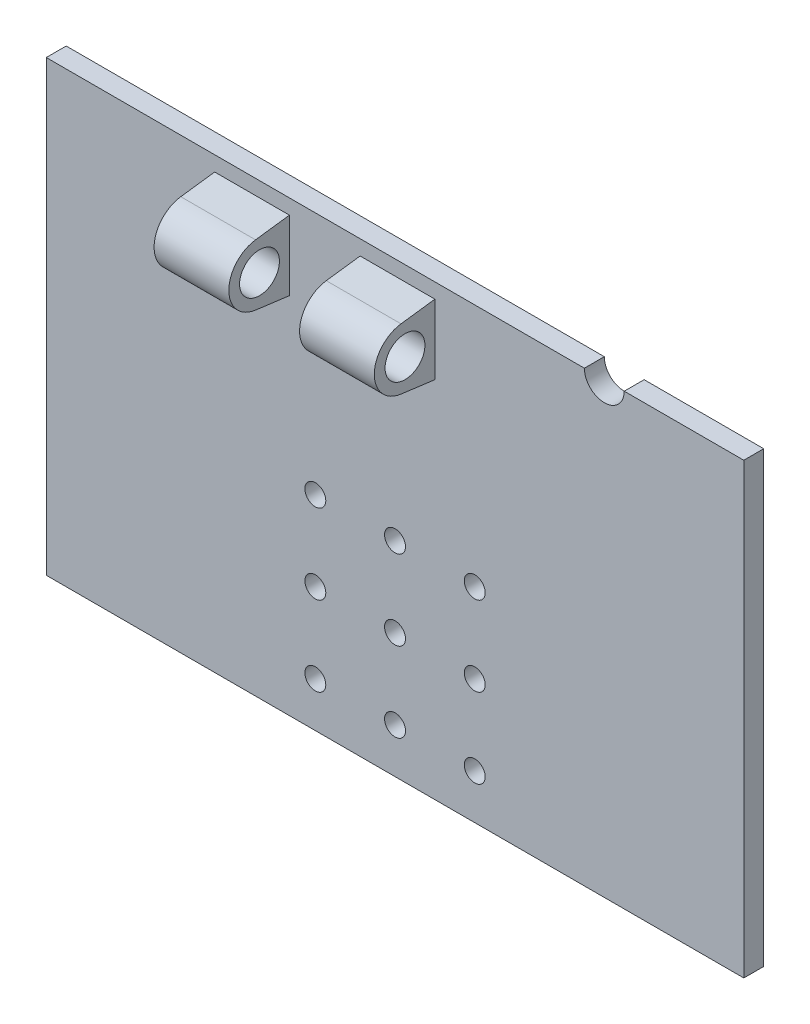
ISO-10303-21;
HEADER;
FILE_DESCRIPTION(('STEP AP214'),'2;1');
FILE_NAME('part.step','',(''),(''),'','','');
FILE_SCHEMA(('AUTOMOTIVE_DESIGN { 1 0 10303 214 1 1 1 1 }'));
ENDSEC;
DATA;
#1=APPLICATION_CONTEXT('core data for automotive mechanical design processes');
#2=APPLICATION_PROTOCOL_DEFINITION('international standard','automotive_design',2000,#1);
#3=PRODUCT_CONTEXT('',#1,'mechanical');
#4=PRODUCT('Part','Part','',(#3));
#5=PRODUCT_RELATED_PRODUCT_CATEGORY('part','',(#4));
#6=PRODUCT_DEFINITION_FORMATION('','',#4);
#7=PRODUCT_DEFINITION_CONTEXT('part definition',#1,'design');
#8=PRODUCT_DEFINITION('design','',#6,#7);
#9=PRODUCT_DEFINITION_SHAPE('','',#8);
#10=(LENGTH_UNIT() NAMED_UNIT(*) SI_UNIT(.MILLI.,.METRE.));
#11=(NAMED_UNIT(*) PLANE_ANGLE_UNIT() SI_UNIT($,.RADIAN.));
#12=(NAMED_UNIT(*) SI_UNIT($,.STERADIAN.) SOLID_ANGLE_UNIT());
#13=UNCERTAINTY_MEASURE_WITH_UNIT(LENGTH_MEASURE(1.E-05),#10,'distance_accuracy_value','');
#14=(GEOMETRIC_REPRESENTATION_CONTEXT(3) GLOBAL_UNCERTAINTY_ASSIGNED_CONTEXT((#13)) GLOBAL_UNIT_ASSIGNED_CONTEXT((#10,
#11,#12)) REPRESENTATION_CONTEXT('',''));
#15=CARTESIAN_POINT('',(0.,0.,0.));
#16=DIRECTION('',(0.,0.,1.));
#17=DIRECTION('',(1.,0.,0.));
#18=AXIS2_PLACEMENT_3D('',#15,#16,#17);
#19=CARTESIAN_POINT('',(0.,45.,2.));
#20=DIRECTION('',(0.,-1.,0.));
#21=DIRECTION('',(0.,0.,-1.));
#22=AXIS2_PLACEMENT_3D('',#19,#20,#21);
#23=PLANE('',#22);
#24=DIRECTION('',(-1.,0.,0.));
#25=VECTOR('',#24,1.);
#26=CARTESIAN_POINT('',(0.,45.,0.));
#27=LINE('',#26,#25);
#28=CARTESIAN_POINT('',(70.,45.,0.));
#29=VERTEX_POINT('',#28);
#30=CARTESIAN_POINT('',(58.,45.,0.));
#31=VERTEX_POINT('',#30);
#32=EDGE_CURVE('E159',#29,#31,#27,.T.);
#33=ORIENTED_EDGE('',*,*,#32,.T.);
#34=DIRECTION('',(0.,0.,1.));
#35=VECTOR('',#34,1.);
#36=CARTESIAN_POINT('',(58.,45.,-8.));
#37=LINE('',#36,#35);
#38=CARTESIAN_POINT('',(58.,45.,2.));
#39=VERTEX_POINT('',#38);
#40=EDGE_CURVE('E60',#31,#39,#37,.T.);
#41=ORIENTED_EDGE('',*,*,#40,.T.);
#42=DIRECTION('',(-1.,0.,0.));
#43=VECTOR('',#42,1.);
#44=CARTESIAN_POINT('',(0.,45.,2.));
#45=LINE('',#44,#43);
#46=CARTESIAN_POINT('',(70.,45.,2.));
#47=VERTEX_POINT('',#46);
#48=EDGE_CURVE('E157',#47,#39,#45,.T.);
#49=ORIENTED_EDGE('',*,*,#48,.F.);
#50=DIRECTION('',(0.,0.,-1.));
#51=VECTOR('',#50,1.);
#52=CARTESIAN_POINT('',(70.,45.,2.));
#53=LINE('',#52,#51);
#54=EDGE_CURVE('E174',#47,#29,#53,.T.);
#55=ORIENTED_EDGE('',*,*,#54,.T.);
#56=EDGE_LOOP('',(#33,#41,#49,#55));
#57=FACE_BOUND('',#56,.T.);
#58=ADVANCED_FACE('F45',(#57),#23,.F.);
#59=CARTESIAN_POINT('',(0.,0.,2.));
#60=DIRECTION('',(0.,0.,-1.));
#61=DIRECTION('',(-1.,0.,0.));
#62=AXIS2_PLACEMENT_3D('',#59,#60,#61);
#63=PLANE('',#62);
#64=DIRECTION('',(0.,-1.,0.));
#65=VECTOR('',#64,1.);
#66=CARTESIAN_POINT('',(24.4,43.5,2.));
#67=LINE('',#66,#65);
#68=CARTESIAN_POINT('',(24.4,43.5,2.));
#69=VERTEX_POINT('',#68);
#70=CARTESIAN_POINT('',(24.4,36.5,2.));
#71=VERTEX_POINT('',#70);
#72=EDGE_CURVE('E299',#69,#71,#67,.T.);
#73=ORIENTED_EDGE('',*,*,#72,.T.);
#74=DIRECTION('',(-1.,0.,0.));
#75=VECTOR('',#74,1.);
#76=CARTESIAN_POINT('',(24.4,36.5,2.));
#77=LINE('',#76,#75);
#78=CARTESIAN_POINT('',(16.9,36.5,2.));
#79=VERTEX_POINT('',#78);
#80=EDGE_CURVE('E284',#71,#79,#77,.T.);
#81=ORIENTED_EDGE('',*,*,#80,.T.);
#82=DIRECTION('',(0.,-1.,0.));
#83=VECTOR('',#82,1.);
#84=CARTESIAN_POINT('',(16.9,43.5,2.));
#85=LINE('',#84,#83);
#86=CARTESIAN_POINT('',(16.9,43.5,2.));
#87=VERTEX_POINT('',#86);
#88=EDGE_CURVE('E309',#87,#79,#85,.T.);
#89=ORIENTED_EDGE('',*,*,#88,.F.);
#90=DIRECTION('',(-1.,0.,0.));
#91=VECTOR('',#90,1.);
#92=CARTESIAN_POINT('',(24.4,43.5,2.));
#93=LINE('',#92,#91);
#94=EDGE_CURVE('E302',#69,#87,#93,.T.);
#95=ORIENTED_EDGE('',*,*,#94,.F.);
#96=EDGE_LOOP('',(#73,#81,#89,#95));
#97=FACE_BOUND('',#96,.T.);
#98=CARTESIAN_POINT('',(43.,4.50000000000011,2.));
#99=DIRECTION('',(0.,0.,1.));
#100=DIRECTION('',(1.,0.,0.));
#101=AXIS2_PLACEMENT_3D('',#98,#99,#100);
#102=CIRCLE('',#101,1.04999999999999);
#103=CARTESIAN_POINT('',(44.05,4.50000000000011,2.));
#104=VERTEX_POINT('',#103);
#105=EDGE_CURVE('E227',#104,#104,#102,.T.);
#106=ORIENTED_EDGE('',*,*,#105,.F.);
#107=EDGE_LOOP('',(#106));
#108=FACE_BOUND('',#107,.T.);
#109=CARTESIAN_POINT('',(27.,4.49999999999995,2.));
#110=DIRECTION('',(0.,0.,1.));
#111=DIRECTION('',(1.,0.,0.));
#112=AXIS2_PLACEMENT_3D('',#109,#110,#111);
#113=CIRCLE('',#112,1.04999999999999);
#114=CARTESIAN_POINT('',(28.05,4.49999999999995,2.));
#115=VERTEX_POINT('',#114);
#116=EDGE_CURVE('E252',#115,#115,#113,.T.);
#117=ORIENTED_EDGE('',*,*,#116,.F.);
#118=EDGE_LOOP('',(#117));
#119=FACE_BOUND('',#118,.T.);
#120=CARTESIAN_POINT('',(35.,12.5,2.));
#121=DIRECTION('',(0.,0.,1.));
#122=DIRECTION('',(1.,0.,0.));
#123=AXIS2_PLACEMENT_3D('',#120,#121,#122);
#124=CIRCLE('',#123,1.04999999999999);
#125=CARTESIAN_POINT('',(36.05,12.5,2.));
#126=VERTEX_POINT('',#125);
#127=EDGE_CURVE('E244',#126,#126,#124,.T.);
#128=ORIENTED_EDGE('',*,*,#127,.F.);
#129=EDGE_LOOP('',(#128));
#130=FACE_BOUND('',#129,.T.);
#131=CARTESIAN_POINT('',(43.,12.5000000000001,2.));
#132=DIRECTION('',(0.,0.,1.));
#133=DIRECTION('',(1.,0.,0.));
#134=AXIS2_PLACEMENT_3D('',#131,#132,#133);
#135=CIRCLE('',#134,1.04999999999999);
#136=CARTESIAN_POINT('',(44.05,12.5000000000001,2.));
#137=VERTEX_POINT('',#136);
#138=EDGE_CURVE('E235',#137,#137,#135,.T.);
#139=ORIENTED_EDGE('',*,*,#138,.F.);
#140=EDGE_LOOP('',(#139));
#141=FACE_BOUND('',#140,.T.);
#142=CARTESIAN_POINT('',(26.9999999999999,20.4999999999999,2.));
#143=DIRECTION('',(0.,0.,1.));
#144=DIRECTION('',(1.,0.,0.));
#145=AXIS2_PLACEMENT_3D('',#142,#143,#144);
#146=CIRCLE('',#145,1.04999999999999);
#147=CARTESIAN_POINT('',(28.0499999999999,20.4999999999999,2.));
#148=VERTEX_POINT('',#147);
#149=EDGE_CURVE('E283',#148,#148,#146,.T.);
#150=ORIENTED_EDGE('',*,*,#149,.F.);
#151=EDGE_LOOP('',(#150));
#152=FACE_BOUND('',#151,.T.);
#153=CARTESIAN_POINT('',(43.,20.5000000000001,2.));
#154=DIRECTION('',(0.,0.,1.));
#155=DIRECTION('',(1.,0.,0.));
#156=AXIS2_PLACEMENT_3D('',#153,#154,#155);
#157=CIRCLE('',#156,1.04999999999999);
#158=CARTESIAN_POINT('',(44.0499999999999,20.5000000000001,2.));
#159=VERTEX_POINT('',#158);
#160=EDGE_CURVE('E268',#159,#159,#157,.T.);
#161=ORIENTED_EDGE('',*,*,#160,.F.);
#162=EDGE_LOOP('',(#161));
#163=FACE_BOUND('',#162,.T.);
#164=CARTESIAN_POINT('',(35.,20.5,2.));
#165=DIRECTION('',(0.,0.,1.));
#166=DIRECTION('',(1.,0.,0.));
#167=AXIS2_PLACEMENT_3D('',#164,#165,#166);
#168=CIRCLE('',#167,1.04999999999999);
#169=CARTESIAN_POINT('',(36.0499999999999,20.5,2.));
#170=VERTEX_POINT('',#169);
#171=EDGE_CURVE('E267',#170,#170,#168,.T.);
#172=ORIENTED_EDGE('',*,*,#171,.F.);
#173=EDGE_LOOP('',(#172));
#174=FACE_BOUND('',#173,.T.);
#175=CARTESIAN_POINT('',(27.,12.4999999999999,2.));
#176=DIRECTION('',(0.,0.,1.));
#177=DIRECTION('',(1.,0.,0.));
#178=AXIS2_PLACEMENT_3D('',#175,#176,#177);
#179=CIRCLE('',#178,1.05);
#180=CARTESIAN_POINT('',(28.05,12.4999999999999,2.));
#181=VERTEX_POINT('',#180);
#182=EDGE_CURVE('E236',#181,#181,#179,.T.);
#183=ORIENTED_EDGE('',*,*,#182,.F.);
#184=EDGE_LOOP('',(#183));
#185=FACE_BOUND('',#184,.T.);
#186=CARTESIAN_POINT('',(35.,4.5,2.));
#187=DIRECTION('',(0.,0.,1.));
#188=DIRECTION('',(1.,0.,0.));
#189=AXIS2_PLACEMENT_3D('',#186,#187,#188);
#190=CIRCLE('',#189,1.04999999999999);
#191=CARTESIAN_POINT('',(36.05,4.5,2.));
#192=VERTEX_POINT('',#191);
#193=EDGE_CURVE('E223',#192,#192,#190,.T.);
#194=ORIENTED_EDGE('',*,*,#193,.F.);
#195=EDGE_LOOP('',(#194));
#196=FACE_BOUND('',#195,.T.);
#197=ORIENTED_EDGE('',*,*,#48,.T.);
#198=CARTESIAN_POINT('',(56.,45.,2.));
#199=DIRECTION('',(0.,0.,1.));
#200=DIRECTION('',(1.,0.,0.));
#201=AXIS2_PLACEMENT_3D('',#198,#199,#200);
#202=CIRCLE('',#201,2.);
#203=CARTESIAN_POINT('',(54.,45.,2.));
#204=VERTEX_POINT('',#203);
#205=EDGE_CURVE('E144',#204,#39,#202,.T.);
#206=ORIENTED_EDGE('',*,*,#205,.F.);
#207=CARTESIAN_POINT('',(0.,45.,2.));
#208=VERTEX_POINT('',#207);
#209=EDGE_CURVE('E169',#204,#208,#45,.T.);
#210=ORIENTED_EDGE('',*,*,#209,.T.);
#211=DIRECTION('',(0.,-1.,0.));
#212=VECTOR('',#211,1.);
#213=CARTESIAN_POINT('',(0.,0.,2.));
#214=LINE('',#213,#212);
#215=CARTESIAN_POINT('',(0.,0.,2.));
#216=VERTEX_POINT('',#215);
#217=EDGE_CURVE('E192',#208,#216,#214,.T.);
#218=ORIENTED_EDGE('',*,*,#217,.T.);
#219=DIRECTION('',(1.,0.,0.));
#220=VECTOR('',#219,1.);
#221=CARTESIAN_POINT('',(0.,0.,2.));
#222=LINE('',#221,#220);
#223=CARTESIAN_POINT('',(70.,0.,2.));
#224=VERTEX_POINT('',#223);
#225=EDGE_CURVE('E205',#216,#224,#222,.T.);
#226=ORIENTED_EDGE('',*,*,#225,.T.);
#227=DIRECTION('',(0.,1.,0.));
#228=VECTOR('',#227,1.);
#229=CARTESIAN_POINT('',(70.,0.,2.));
#230=LINE('',#229,#228);
#231=EDGE_CURVE('E165',#224,#47,#230,.T.);
#232=ORIENTED_EDGE('',*,*,#231,.T.);
#233=EDGE_LOOP('',(#197,#206,#210,#218,#226,#232));
#234=FACE_BOUND('',#233,.T.);
#235=DIRECTION('',(1.,0.,0.));
#236=VECTOR('',#235,1.);
#237=CARTESIAN_POINT('',(31.5,36.5,2.));
#238=LINE('',#237,#236);
#239=CARTESIAN_POINT('',(31.5,36.5,2.));
#240=VERTEX_POINT('',#239);
#241=CARTESIAN_POINT('',(39.,36.5,2.));
#242=VERTEX_POINT('',#241);
#243=EDGE_CURVE('E68',#240,#242,#238,.T.);
#244=ORIENTED_EDGE('',*,*,#243,.F.);
#245=DIRECTION('',(0.,-1.,0.));
#246=VECTOR('',#245,1.);
#247=CARTESIAN_POINT('',(31.5,43.5,2.));
#248=LINE('',#247,#246);
#249=CARTESIAN_POINT('',(31.5,43.5,2.));
#250=VERTEX_POINT('',#249);
#251=EDGE_CURVE('E382',#250,#240,#248,.T.);
#252=ORIENTED_EDGE('',*,*,#251,.F.);
#253=DIRECTION('',(1.,0.,0.));
#254=VECTOR('',#253,1.);
#255=CARTESIAN_POINT('',(31.5,43.5,2.));
#256=LINE('',#255,#254);
#257=CARTESIAN_POINT('',(39.,43.5,2.));
#258=VERTEX_POINT('',#257);
#259=EDGE_CURVE('E349',#250,#258,#256,.T.);
#260=ORIENTED_EDGE('',*,*,#259,.T.);
#261=DIRECTION('',(0.,-1.,0.));
#262=VECTOR('',#261,1.);
#263=CARTESIAN_POINT('',(39.,43.5,2.));
#264=LINE('',#263,#262);
#265=EDGE_CURVE('E368',#258,#242,#264,.T.);
#266=ORIENTED_EDGE('',*,*,#265,.T.);
#267=EDGE_LOOP('',(#244,#252,#260,#266));
#268=FACE_BOUND('',#267,.T.);
#269=ADVANCED_FACE('F163',(#97,#108,#119,#130,#141,#152,#163,#174,#185,#196,#234,#268),#63,.F.);
#270=CARTESIAN_POINT('',(0.,0.,2.));
#271=DIRECTION('',(1.,0.,0.));
#272=DIRECTION('',(0.,0.,-1.));
#273=AXIS2_PLACEMENT_3D('',#270,#271,#272);
#274=PLANE('',#273);
#275=DIRECTION('',(0.,-1.,0.));
#276=VECTOR('',#275,1.);
#277=CARTESIAN_POINT('',(0.,0.,0.));
#278=LINE('',#277,#276);
#279=CARTESIAN_POINT('',(0.,45.,0.));
#280=VERTEX_POINT('',#279);
#281=CARTESIAN_POINT('',(0.,0.,0.));
#282=VERTEX_POINT('',#281);
#283=EDGE_CURVE('E179',#280,#282,#278,.T.);
#284=ORIENTED_EDGE('',*,*,#283,.T.);
#285=DIRECTION('',(0.,0.,-1.));
#286=VECTOR('',#285,1.);
#287=CARTESIAN_POINT('',(0.,0.,2.));
#288=LINE('',#287,#286);
#289=EDGE_CURVE('E54',#216,#282,#288,.T.);
#290=ORIENTED_EDGE('',*,*,#289,.F.);
#291=ORIENTED_EDGE('',*,*,#217,.F.);
#292=DIRECTION('',(0.,0.,-1.));
#293=VECTOR('',#292,1.);
#294=CARTESIAN_POINT('',(0.,45.,2.));
#295=LINE('',#294,#293);
#296=EDGE_CURVE('E168',#208,#280,#295,.T.);
#297=ORIENTED_EDGE('',*,*,#296,.T.);
#298=EDGE_LOOP('',(#284,#290,#291,#297));
#299=FACE_BOUND('',#298,.T.);
#300=ADVANCED_FACE('F47',(#299),#274,.F.);
#301=CARTESIAN_POINT('',(0.,0.,2.));
#302=DIRECTION('',(0.,1.,0.));
#303=DIRECTION('',(0.,0.,1.));
#304=AXIS2_PLACEMENT_3D('',#301,#302,#303);
#305=PLANE('',#304);
#306=DIRECTION('',(1.,0.,0.));
#307=VECTOR('',#306,1.);
#308=CARTESIAN_POINT('',(0.,0.,0.));
#309=LINE('',#308,#307);
#310=CARTESIAN_POINT('',(70.,0.,0.));
#311=VERTEX_POINT('',#310);
#312=EDGE_CURVE('E183',#282,#311,#309,.T.);
#313=ORIENTED_EDGE('',*,*,#312,.T.);
#314=DIRECTION('',(0.,0.,-1.));
#315=VECTOR('',#314,1.);
#316=CARTESIAN_POINT('',(70.,0.,2.));
#317=LINE('',#316,#315);
#318=EDGE_CURVE('E196',#224,#311,#317,.T.);
#319=ORIENTED_EDGE('',*,*,#318,.F.);
#320=ORIENTED_EDGE('',*,*,#225,.F.);
#321=ORIENTED_EDGE('',*,*,#289,.T.);
#322=EDGE_LOOP('',(#313,#319,#320,#321));
#323=FACE_BOUND('',#322,.T.);
#324=ADVANCED_FACE('F203',(#323),#305,.F.);
#325=CARTESIAN_POINT('',(70.,0.,2.));
#326=DIRECTION('',(-1.,0.,0.));
#327=DIRECTION('',(0.,0.,1.));
#328=AXIS2_PLACEMENT_3D('',#325,#326,#327);
#329=PLANE('',#328);
#330=DIRECTION('',(0.,1.,0.));
#331=VECTOR('',#330,1.);
#332=CARTESIAN_POINT('',(70.,0.,0.));
#333=LINE('',#332,#331);
#334=EDGE_CURVE('E187',#311,#29,#333,.T.);
#335=ORIENTED_EDGE('',*,*,#334,.T.);
#336=ORIENTED_EDGE('',*,*,#54,.F.);
#337=ORIENTED_EDGE('',*,*,#231,.F.);
#338=ORIENTED_EDGE('',*,*,#318,.T.);
#339=EDGE_LOOP('',(#335,#336,#337,#338));
#340=FACE_BOUND('',#339,.T.);
#341=ADVANCED_FACE('F217',(#340),#329,.F.);
#342=ORIENTED_EDGE('',*,*,#209,.F.);
#343=DIRECTION('',(0.,0.,1.));
#344=VECTOR('',#343,1.);
#345=CARTESIAN_POINT('',(54.,45.,-8.));
#346=LINE('',#345,#344);
#347=CARTESIAN_POINT('',(54.,45.,0.));
#348=VERTEX_POINT('',#347);
#349=EDGE_CURVE('E147',#204,#348,#346,.F.);
#350=ORIENTED_EDGE('',*,*,#349,.T.);
#351=EDGE_CURVE('E190',#348,#280,#27,.T.);
#352=ORIENTED_EDGE('',*,*,#351,.T.);
#353=ORIENTED_EDGE('',*,*,#296,.F.);
#354=EDGE_LOOP('',(#342,#350,#352,#353));
#355=FACE_BOUND('',#354,.T.);
#356=ADVANCED_FACE('F396',(#355),#23,.F.);
#357=CARTESIAN_POINT('',(0.,0.,0.));
#358=DIRECTION('',(0.,0.,-1.));
#359=DIRECTION('',(-1.,0.,0.));
#360=AXIS2_PLACEMENT_3D('',#357,#358,#359);
#361=PLANE('',#360);
#362=CARTESIAN_POINT('',(56.,45.,0.));
#363=DIRECTION('',(0.,0.,-1.));
#364=DIRECTION('',(-1.,0.,0.));
#365=AXIS2_PLACEMENT_3D('',#362,#363,#364);
#366=CIRCLE('',#365,2.);
#367=EDGE_CURVE('E11',#31,#348,#366,.T.);
#368=ORIENTED_EDGE('',*,*,#367,.F.);
#369=ORIENTED_EDGE('',*,*,#32,.F.);
#370=ORIENTED_EDGE('',*,*,#334,.F.);
#371=ORIENTED_EDGE('',*,*,#312,.F.);
#372=ORIENTED_EDGE('',*,*,#283,.F.);
#373=ORIENTED_EDGE('',*,*,#351,.F.);
#374=EDGE_LOOP('',(#368,#369,#370,#371,#372,#373));
#375=FACE_BOUND('',#374,.T.);
#376=CARTESIAN_POINT('',(43.,4.50000000000011,0.));
#377=DIRECTION('',(0.,0.,1.));
#378=DIRECTION('',(1.,0.,0.));
#379=AXIS2_PLACEMENT_3D('',#376,#377,#378);
#380=CIRCLE('',#379,1.04999999999999);
#381=CARTESIAN_POINT('',(44.05,4.50000000000011,0.));
#382=VERTEX_POINT('',#381);
#383=EDGE_CURVE('E256',#382,#382,#380,.T.);
#384=ORIENTED_EDGE('',*,*,#383,.T.);
#385=EDGE_LOOP('',(#384));
#386=FACE_BOUND('',#385,.T.);
#387=CARTESIAN_POINT('',(27.,4.49999999999995,0.));
#388=DIRECTION('',(0.,0.,1.));
#389=DIRECTION('',(1.,0.,0.));
#390=AXIS2_PLACEMENT_3D('',#387,#388,#389);
#391=CIRCLE('',#390,1.04999999999999);
#392=CARTESIAN_POINT('',(28.05,4.49999999999995,0.));
#393=VERTEX_POINT('',#392);
#394=EDGE_CURVE('E248',#393,#393,#391,.T.);
#395=ORIENTED_EDGE('',*,*,#394,.T.);
#396=EDGE_LOOP('',(#395));
#397=FACE_BOUND('',#396,.T.);
#398=CARTESIAN_POINT('',(35.,12.5,0.));
#399=DIRECTION('',(0.,0.,1.));
#400=DIRECTION('',(1.,0.,0.));
#401=AXIS2_PLACEMENT_3D('',#398,#399,#400);
#402=CIRCLE('',#401,1.04999999999999);
#403=CARTESIAN_POINT('',(36.05,12.5,0.));
#404=VERTEX_POINT('',#403);
#405=EDGE_CURVE('E240',#404,#404,#402,.T.);
#406=ORIENTED_EDGE('',*,*,#405,.T.);
#407=EDGE_LOOP('',(#406));
#408=FACE_BOUND('',#407,.T.);
#409=CARTESIAN_POINT('',(43.,12.5000000000001,0.));
#410=DIRECTION('',(0.,0.,1.));
#411=DIRECTION('',(1.,0.,0.));
#412=AXIS2_PLACEMENT_3D('',#409,#410,#411);
#413=CIRCLE('',#412,1.04999999999999);
#414=CARTESIAN_POINT('',(44.05,12.5000000000001,0.));
#415=VERTEX_POINT('',#414);
#416=EDGE_CURVE('E231',#415,#415,#413,.T.);
#417=ORIENTED_EDGE('',*,*,#416,.T.);
#418=EDGE_LOOP('',(#417));
#419=FACE_BOUND('',#418,.T.);
#420=CARTESIAN_POINT('',(26.9999999999999,20.4999999999999,0.));
#421=DIRECTION('',(0.,0.,1.));
#422=DIRECTION('',(1.,0.,0.));
#423=AXIS2_PLACEMENT_3D('',#420,#421,#422);
#424=CIRCLE('',#423,1.04999999999999);
#425=CARTESIAN_POINT('',(28.0499999999999,20.4999999999999,0.));
#426=VERTEX_POINT('',#425);
#427=EDGE_CURVE('E279',#426,#426,#424,.T.);
#428=ORIENTED_EDGE('',*,*,#427,.T.);
#429=EDGE_LOOP('',(#428));
#430=FACE_BOUND('',#429,.T.);
#431=CARTESIAN_POINT('',(43.,20.5000000000001,0.));
#432=DIRECTION('',(0.,0.,1.));
#433=DIRECTION('',(1.,0.,0.));
#434=AXIS2_PLACEMENT_3D('',#431,#432,#433);
#435=CIRCLE('',#434,1.04999999999999);
#436=CARTESIAN_POINT('',(44.0499999999999,20.5000000000001,0.));
#437=VERTEX_POINT('',#436);
#438=EDGE_CURVE('E288',#437,#437,#435,.T.);
#439=ORIENTED_EDGE('',*,*,#438,.T.);
#440=EDGE_LOOP('',(#439));
#441=FACE_BOUND('',#440,.T.);
#442=CARTESIAN_POINT('',(35.,20.5,0.));
#443=DIRECTION('',(0.,0.,1.));
#444=DIRECTION('',(1.,0.,0.));
#445=AXIS2_PLACEMENT_3D('',#442,#443,#444);
#446=CIRCLE('',#445,1.04999999999999);
#447=CARTESIAN_POINT('',(36.0499999999999,20.5,0.));
#448=VERTEX_POINT('',#447);
#449=EDGE_CURVE('E263',#448,#448,#446,.T.);
#450=ORIENTED_EDGE('',*,*,#449,.T.);
#451=EDGE_LOOP('',(#450));
#452=FACE_BOUND('',#451,.T.);
#453=CARTESIAN_POINT('',(27.,12.4999999999999,0.));
#454=DIRECTION('',(0.,0.,1.));
#455=DIRECTION('',(1.,0.,0.));
#456=AXIS2_PLACEMENT_3D('',#453,#454,#455);
#457=CIRCLE('',#456,1.05);
#458=CARTESIAN_POINT('',(28.05,12.4999999999999,0.));
#459=VERTEX_POINT('',#458);
#460=EDGE_CURVE('E272',#459,#459,#457,.T.);
#461=ORIENTED_EDGE('',*,*,#460,.T.);
#462=EDGE_LOOP('',(#461));
#463=FACE_BOUND('',#462,.T.);
#464=CARTESIAN_POINT('',(35.,4.5,0.));
#465=DIRECTION('',(0.,0.,1.));
#466=DIRECTION('',(1.,0.,0.));
#467=AXIS2_PLACEMENT_3D('',#464,#465,#466);
#468=CIRCLE('',#467,1.04999999999999);
#469=CARTESIAN_POINT('',(36.05,4.5,0.));
#470=VERTEX_POINT('',#469);
#471=EDGE_CURVE('E184',#470,#470,#468,.T.);
#472=ORIENTED_EDGE('',*,*,#471,.T.);
#473=EDGE_LOOP('',(#472));
#474=FACE_BOUND('',#473,.T.);
#475=ADVANCED_FACE('F213',(#375,#386,#397,#408,#419,#430,#441,#452,#463,#474),#361,.T.);
#476=CARTESIAN_POINT('',(35.,4.5,0.));
#477=DIRECTION('',(0.,0.,1.));
#478=DIRECTION('',(1.,0.,0.));
#479=AXIS2_PLACEMENT_3D('',#476,#477,#478);
#480=CYLINDRICAL_SURFACE('',#479,1.04999999999999);
#481=ORIENTED_EDGE('',*,*,#471,.F.);
#482=EDGE_LOOP('',(#481));
#483=FACE_BOUND('',#482,.T.);
#484=ORIENTED_EDGE('',*,*,#193,.T.);
#485=EDGE_LOOP('',(#484));
#486=FACE_BOUND('',#485,.T.);
#487=ADVANCED_FACE('F404',(#483,#486),#480,.F.);
#488=CARTESIAN_POINT('',(27.,12.4999999999999,0.));
#489=DIRECTION('',(0.,0.,1.));
#490=DIRECTION('',(1.,0.,0.));
#491=AXIS2_PLACEMENT_3D('',#488,#489,#490);
#492=CYLINDRICAL_SURFACE('',#491,1.05);
#493=ORIENTED_EDGE('',*,*,#460,.F.);
#494=EDGE_LOOP('',(#493));
#495=FACE_BOUND('',#494,.T.);
#496=ORIENTED_EDGE('',*,*,#182,.T.);
#497=EDGE_LOOP('',(#496));
#498=FACE_BOUND('',#497,.T.);
#499=ADVANCED_FACE('F421',(#495,#498),#492,.F.);
#500=CARTESIAN_POINT('',(35.,20.5,0.));
#501=DIRECTION('',(0.,0.,1.));
#502=DIRECTION('',(1.,0.,0.));
#503=AXIS2_PLACEMENT_3D('',#500,#501,#502);
#504=CYLINDRICAL_SURFACE('',#503,1.04999999999999);
#505=ORIENTED_EDGE('',*,*,#449,.F.);
#506=EDGE_LOOP('',(#505));
#507=FACE_BOUND('',#506,.T.);
#508=ORIENTED_EDGE('',*,*,#171,.T.);
#509=EDGE_LOOP('',(#508));
#510=FACE_BOUND('',#509,.T.);
#511=ADVANCED_FACE('F441',(#507,#510),#504,.F.);
#512=CARTESIAN_POINT('',(43.,20.5000000000001,0.));
#513=DIRECTION('',(0.,0.,1.));
#514=DIRECTION('',(1.,0.,0.));
#515=AXIS2_PLACEMENT_3D('',#512,#513,#514);
#516=CYLINDRICAL_SURFACE('',#515,1.04999999999999);
#517=ORIENTED_EDGE('',*,*,#438,.F.);
#518=EDGE_LOOP('',(#517));
#519=FACE_BOUND('',#518,.T.);
#520=ORIENTED_EDGE('',*,*,#160,.T.);
#521=EDGE_LOOP('',(#520));
#522=FACE_BOUND('',#521,.T.);
#523=ADVANCED_FACE('F444',(#519,#522),#516,.F.);
#524=CARTESIAN_POINT('',(26.9999999999999,20.4999999999999,0.));
#525=DIRECTION('',(0.,0.,1.));
#526=DIRECTION('',(1.,0.,0.));
#527=AXIS2_PLACEMENT_3D('',#524,#525,#526);
#528=CYLINDRICAL_SURFACE('',#527,1.04999999999999);
#529=ORIENTED_EDGE('',*,*,#427,.F.);
#530=EDGE_LOOP('',(#529));
#531=FACE_BOUND('',#530,.T.);
#532=ORIENTED_EDGE('',*,*,#149,.T.);
#533=EDGE_LOOP('',(#532));
#534=FACE_BOUND('',#533,.T.);
#535=ADVANCED_FACE('F427',(#531,#534),#528,.F.);
#536=CARTESIAN_POINT('',(43.,12.5000000000001,0.));
#537=DIRECTION('',(0.,0.,1.));
#538=DIRECTION('',(1.,0.,0.));
#539=AXIS2_PLACEMENT_3D('',#536,#537,#538);
#540=CYLINDRICAL_SURFACE('',#539,1.04999999999999);
#541=ORIENTED_EDGE('',*,*,#416,.F.);
#542=EDGE_LOOP('',(#541));
#543=FACE_BOUND('',#542,.T.);
#544=ORIENTED_EDGE('',*,*,#138,.T.);
#545=EDGE_LOOP('',(#544));
#546=FACE_BOUND('',#545,.T.);
#547=ADVANCED_FACE('F423',(#543,#546),#540,.F.);
#548=CARTESIAN_POINT('',(35.,12.5,0.));
#549=DIRECTION('',(0.,0.,1.));
#550=DIRECTION('',(1.,0.,0.));
#551=AXIS2_PLACEMENT_3D('',#548,#549,#550);
#552=CYLINDRICAL_SURFACE('',#551,1.04999999999999);
#553=ORIENTED_EDGE('',*,*,#405,.F.);
#554=EDGE_LOOP('',(#553));
#555=FACE_BOUND('',#554,.T.);
#556=ORIENTED_EDGE('',*,*,#127,.T.);
#557=EDGE_LOOP('',(#556));
#558=FACE_BOUND('',#557,.T.);
#559=ADVANCED_FACE('F426',(#555,#558),#552,.F.);
#560=CARTESIAN_POINT('',(27.,4.49999999999995,0.));
#561=DIRECTION('',(0.,0.,1.));
#562=DIRECTION('',(1.,0.,0.));
#563=AXIS2_PLACEMENT_3D('',#560,#561,#562);
#564=CYLINDRICAL_SURFACE('',#563,1.04999999999999);
#565=ORIENTED_EDGE('',*,*,#394,.F.);
#566=EDGE_LOOP('',(#565));
#567=FACE_BOUND('',#566,.T.);
#568=ORIENTED_EDGE('',*,*,#116,.T.);
#569=EDGE_LOOP('',(#568));
#570=FACE_BOUND('',#569,.T.);
#571=ADVANCED_FACE('F431',(#567,#570),#564,.F.);
#572=CARTESIAN_POINT('',(43.,4.50000000000011,0.));
#573=DIRECTION('',(0.,0.,1.));
#574=DIRECTION('',(1.,0.,0.));
#575=AXIS2_PLACEMENT_3D('',#572,#573,#574);
#576=CYLINDRICAL_SURFACE('',#575,1.04999999999999);
#577=ORIENTED_EDGE('',*,*,#383,.F.);
#578=EDGE_LOOP('',(#577));
#579=FACE_BOUND('',#578,.T.);
#580=ORIENTED_EDGE('',*,*,#105,.T.);
#581=EDGE_LOOP('',(#580));
#582=FACE_BOUND('',#581,.T.);
#583=ADVANCED_FACE('F435',(#579,#582),#576,.F.);
#584=CARTESIAN_POINT('',(24.4,36.5,2.));
#585=DIRECTION('',(0.,-0.991502657467044,0.130086433711551));
#586=DIRECTION('',(0.,-0.130086433711551,-0.991502657467044));
#587=AXIS2_PLACEMENT_3D('',#584,#585,#586);
#588=PLANE('',#587);
#589=DIRECTION('',(0.,0.130086433711551,0.991502657467044));
#590=VECTOR('',#589,1.);
#591=CARTESIAN_POINT('',(16.9,36.5,2.));
#592=LINE('',#591,#590);
#593=CARTESIAN_POINT('',(16.9,36.9461718150015,5.40066621583158));
#594=VERTEX_POINT('',#593);
#595=EDGE_CURVE('E321',#79,#594,#592,.T.);
#596=ORIENTED_EDGE('',*,*,#595,.F.);
#597=ORIENTED_EDGE('',*,*,#80,.F.);
#598=DIRECTION('',(0.,0.130086433711551,0.991502657467044));
#599=VECTOR('',#598,1.);
#600=CARTESIAN_POINT('',(24.4,36.5,2.));
#601=LINE('',#600,#599);
#602=CARTESIAN_POINT('',(24.4,36.9461718150015,5.40066621583158));
#603=VERTEX_POINT('',#602);
#604=EDGE_CURVE('E313',#71,#603,#601,.T.);
#605=ORIENTED_EDGE('',*,*,#604,.T.);
#606=DIRECTION('',(-1.,0.,0.));
#607=VECTOR('',#606,1.);
#608=CARTESIAN_POINT('',(24.4,36.9461718150015,5.40066621583158));
#609=LINE('',#608,#607);
#610=EDGE_CURVE('E295',#603,#594,#609,.T.);
#611=ORIENTED_EDGE('',*,*,#610,.T.);
#612=EDGE_LOOP('',(#596,#597,#605,#611));
#613=FACE_BOUND('',#612,.T.);
#614=ADVANCED_FACE('F439',(#613),#588,.T.);
#615=CARTESIAN_POINT('',(24.4,43.5,2.));
#616=DIRECTION('',(0.,0.991502657467044,0.130086433711552));
#617=DIRECTION('',(0.,-0.130086433711552,0.991502657467044));
#618=AXIS2_PLACEMENT_3D('',#615,#616,#617);
#619=PLANE('',#618);
#620=DIRECTION('',(0.,0.130086433711552,-0.991502657467044));
#621=VECTOR('',#620,1.);
#622=CARTESIAN_POINT('',(16.9,43.5,2.));
#623=LINE('',#622,#621);
#624=CARTESIAN_POINT('',(16.9,43.0538281849985,5.40066621583157));
#625=VERTEX_POINT('',#624);
#626=EDGE_CURVE('E314',#625,#87,#623,.T.);
#627=ORIENTED_EDGE('',*,*,#626,.F.);
#628=DIRECTION('',(-1.,0.,0.));
#629=VECTOR('',#628,1.);
#630=CARTESIAN_POINT('',(24.4,43.0538281849985,5.40066621583157));
#631=LINE('',#630,#629);
#632=CARTESIAN_POINT('',(24.4,43.0538281849985,5.40066621583157));
#633=VERTEX_POINT('',#632);
#634=EDGE_CURVE('E298',#633,#625,#631,.T.);
#635=ORIENTED_EDGE('',*,*,#634,.F.);
#636=DIRECTION('',(0.,0.130086433711552,-0.991502657467044));
#637=VECTOR('',#636,1.);
#638=CARTESIAN_POINT('',(24.4,43.5,2.));
#639=LINE('',#638,#637);
#640=EDGE_CURVE('E329',#633,#69,#639,.T.);
#641=ORIENTED_EDGE('',*,*,#640,.T.);
#642=ORIENTED_EDGE('',*,*,#94,.T.);
#643=EDGE_LOOP('',(#627,#635,#641,#642));
#644=FACE_BOUND('',#643,.T.);
#645=ADVANCED_FACE('F457',(#644),#619,.T.);
#646=CARTESIAN_POINT('',(24.4,40.,5.));
#647=DIRECTION('',(-1.,0.,0.));
#648=DIRECTION('',(0.,0.,1.));
#649=AXIS2_PLACEMENT_3D('',#646,#647,#648);
#650=CYLINDRICAL_SURFACE('',#649,3.08);
#651=CARTESIAN_POINT('',(16.9,40.,5.));
#652=DIRECTION('',(-1.,0.,0.));
#653=DIRECTION('',(0.,0.,1.));
#654=AXIS2_PLACEMENT_3D('',#651,#652,#653);
#655=CIRCLE('',#654,3.08);
#656=EDGE_CURVE('E317',#594,#625,#655,.T.);
#657=ORIENTED_EDGE('',*,*,#656,.F.);
#658=ORIENTED_EDGE('',*,*,#610,.F.);
#659=CARTESIAN_POINT('',(24.4,40.,5.));
#660=DIRECTION('',(-1.,0.,0.));
#661=DIRECTION('',(0.,0.,1.));
#662=AXIS2_PLACEMENT_3D('',#659,#660,#661);
#663=CIRCLE('',#662,3.08);
#664=EDGE_CURVE('E332',#603,#633,#663,.T.);
#665=ORIENTED_EDGE('',*,*,#664,.T.);
#666=ORIENTED_EDGE('',*,*,#634,.T.);
#667=EDGE_LOOP('',(#657,#658,#665,#666));
#668=FACE_BOUND('',#667,.T.);
#669=ADVANCED_FACE('F459',(#668),#650,.T.);
#670=CARTESIAN_POINT('',(24.4,40.,5.));
#671=DIRECTION('',(-1.,0.,0.));
#672=DIRECTION('',(0.,0.,1.));
#673=AXIS2_PLACEMENT_3D('',#670,#671,#672);
#674=PLANE('',#673);
#675=CARTESIAN_POINT('',(24.4,40.,5.));
#676=DIRECTION('',(-1.,0.,0.));
#677=DIRECTION('',(0.,0.,1.));
#678=AXIS2_PLACEMENT_3D('',#675,#676,#677);
#679=CIRCLE('',#678,2.);
#680=CARTESIAN_POINT('',(24.4,40.,7.));
#681=VERTEX_POINT('',#680);
#682=EDGE_CURVE('E325',#681,#681,#679,.T.);
#683=ORIENTED_EDGE('',*,*,#682,.T.);
#684=EDGE_LOOP('',(#683));
#685=FACE_BOUND('',#684,.T.);
#686=ORIENTED_EDGE('',*,*,#604,.F.);
#687=ORIENTED_EDGE('',*,*,#72,.F.);
#688=ORIENTED_EDGE('',*,*,#640,.F.);
#689=ORIENTED_EDGE('',*,*,#664,.F.);
#690=EDGE_LOOP('',(#686,#687,#688,#689));
#691=FACE_BOUND('',#690,.T.);
#692=ADVANCED_FACE('F462',(#685,#691),#674,.F.);
#693=CARTESIAN_POINT('',(16.9,40.,5.));
#694=DIRECTION('',(-1.,0.,0.));
#695=DIRECTION('',(0.,0.,1.));
#696=AXIS2_PLACEMENT_3D('',#693,#694,#695);
#697=PLANE('',#696);
#698=CARTESIAN_POINT('',(16.9,40.,5.));
#699=DIRECTION('',(-1.,0.,0.));
#700=DIRECTION('',(0.,0.,1.));
#701=AXIS2_PLACEMENT_3D('',#698,#699,#700);
#702=CIRCLE('',#701,2.);
#703=CARTESIAN_POINT('',(16.9,40.,7.));
#704=VERTEX_POINT('',#703);
#705=EDGE_CURVE('E339',#704,#704,#702,.T.);
#706=ORIENTED_EDGE('',*,*,#705,.F.);
#707=EDGE_LOOP('',(#706));
#708=FACE_BOUND('',#707,.T.);
#709=ORIENTED_EDGE('',*,*,#595,.T.);
#710=ORIENTED_EDGE('',*,*,#656,.T.);
#711=ORIENTED_EDGE('',*,*,#626,.T.);
#712=ORIENTED_EDGE('',*,*,#88,.T.);
#713=EDGE_LOOP('',(#709,#710,#711,#712));
#714=FACE_BOUND('',#713,.T.);
#715=ADVANCED_FACE('F467',(#708,#714),#697,.T.);
#716=CARTESIAN_POINT('',(24.4,40.,5.));
#717=DIRECTION('',(-1.,0.,0.));
#718=DIRECTION('',(0.,0.,1.));
#719=AXIS2_PLACEMENT_3D('',#716,#717,#718);
#720=CYLINDRICAL_SURFACE('',#719,2.);
#721=ORIENTED_EDGE('',*,*,#682,.F.);
#722=EDGE_LOOP('',(#721));
#723=FACE_BOUND('',#722,.T.);
#724=ORIENTED_EDGE('',*,*,#705,.T.);
#725=EDGE_LOOP('',(#724));
#726=FACE_BOUND('',#725,.T.);
#727=ADVANCED_FACE('F470',(#723,#726),#720,.F.);
#728=CARTESIAN_POINT('',(31.5,40.,5.));
#729=DIRECTION('',(1.,0.,0.));
#730=DIRECTION('',(0.,0.,1.));
#731=AXIS2_PLACEMENT_3D('',#728,#729,#730);
#732=PLANE('',#731);
#733=DIRECTION('',(0.,0.130086433711551,0.991502657467044));
#734=VECTOR('',#733,1.);
#735=CARTESIAN_POINT('',(31.5,36.5,2.));
#736=LINE('',#735,#734);
#737=CARTESIAN_POINT('',(31.5,36.9461718150015,5.40066621583158));
#738=VERTEX_POINT('',#737);
#739=EDGE_CURVE('E363',#240,#738,#736,.T.);
#740=ORIENTED_EDGE('',*,*,#739,.T.);
#741=CARTESIAN_POINT('',(31.5,40.,5.));
#742=DIRECTION('',(-1.,0.,0.));
#743=DIRECTION('',(0.,0.,1.));
#744=AXIS2_PLACEMENT_3D('',#741,#742,#743);
#745=CIRCLE('',#744,3.08);
#746=CARTESIAN_POINT('',(31.5,43.0538281849985,5.40066621583157));
#747=VERTEX_POINT('',#746);
#748=EDGE_CURVE('E350',#738,#747,#745,.T.);
#749=ORIENTED_EDGE('',*,*,#748,.T.);
#750=DIRECTION('',(0.,0.130086433711552,-0.991502657467044));
#751=VECTOR('',#750,1.);
#752=CARTESIAN_POINT('',(31.5,43.5,2.));
#753=LINE('',#752,#751);
#754=EDGE_CURVE('E378',#747,#250,#753,.T.);
#755=ORIENTED_EDGE('',*,*,#754,.T.);
#756=ORIENTED_EDGE('',*,*,#251,.T.);
#757=EDGE_LOOP('',(#740,#749,#755,#756));
#758=FACE_BOUND('',#757,.T.);
#759=CARTESIAN_POINT('',(31.5,40.,5.));
#760=DIRECTION('',(-1.,0.,0.));
#761=DIRECTION('',(0.,0.,1.));
#762=AXIS2_PLACEMENT_3D('',#759,#760,#761);
#763=CIRCLE('',#762,2.);
#764=CARTESIAN_POINT('',(31.5,40.,7.));
#765=VERTEX_POINT('',#764);
#766=EDGE_CURVE('E375',#765,#765,#763,.T.);
#767=ORIENTED_EDGE('',*,*,#766,.F.);
#768=EDGE_LOOP('',(#767));
#769=FACE_BOUND('',#768,.T.);
#770=ADVANCED_FACE('F477',(#758,#769),#732,.F.);
#771=CARTESIAN_POINT('',(39.,40.,5.));
#772=DIRECTION('',(1.,0.,0.));
#773=DIRECTION('',(0.,0.,1.));
#774=AXIS2_PLACEMENT_3D('',#771,#772,#773);
#775=PLANE('',#774);
#776=DIRECTION('',(0.,0.130086433711551,0.991502657467044));
#777=VECTOR('',#776,1.);
#778=CARTESIAN_POINT('',(39.,36.5,2.));
#779=LINE('',#778,#777);
#780=CARTESIAN_POINT('',(39.,36.9461718150015,5.40066621583158));
#781=VERTEX_POINT('',#780);
#782=EDGE_CURVE('E371',#242,#781,#779,.T.);
#783=ORIENTED_EDGE('',*,*,#782,.F.);
#784=ORIENTED_EDGE('',*,*,#265,.F.);
#785=DIRECTION('',(0.,0.130086433711552,-0.991502657467044));
#786=VECTOR('',#785,1.);
#787=CARTESIAN_POINT('',(39.,43.5,2.));
#788=LINE('',#787,#786);
#789=CARTESIAN_POINT('',(39.,43.0538281849985,5.40066621583157));
#790=VERTEX_POINT('',#789);
#791=EDGE_CURVE('E364',#790,#258,#788,.T.);
#792=ORIENTED_EDGE('',*,*,#791,.F.);
#793=CARTESIAN_POINT('',(39.,40.,5.));
#794=DIRECTION('',(-1.,0.,0.));
#795=DIRECTION('',(0.,0.,1.));
#796=AXIS2_PLACEMENT_3D('',#793,#794,#795);
#797=CIRCLE('',#796,3.08);
#798=EDGE_CURVE('E360',#781,#790,#797,.T.);
#799=ORIENTED_EDGE('',*,*,#798,.F.);
#800=EDGE_LOOP('',(#783,#784,#792,#799));
#801=FACE_BOUND('',#800,.T.);
#802=CARTESIAN_POINT('',(39.,40.,5.));
#803=DIRECTION('',(-1.,0.,0.));
#804=DIRECTION('',(0.,0.,1.));
#805=AXIS2_PLACEMENT_3D('',#802,#803,#804);
#806=CIRCLE('',#805,2.);
#807=CARTESIAN_POINT('',(39.,40.,7.));
#808=VERTEX_POINT('',#807);
#809=EDGE_CURVE('E161',#808,#808,#806,.T.);
#810=ORIENTED_EDGE('',*,*,#809,.T.);
#811=EDGE_LOOP('',(#810));
#812=FACE_BOUND('',#811,.T.);
#813=ADVANCED_FACE('F483',(#801,#812),#775,.T.);
#814=CARTESIAN_POINT('',(31.5,36.5,2.));
#815=DIRECTION('',(0.,0.991502657467044,-0.130086433711551));
#816=DIRECTION('',(0.,0.130086433711551,0.991502657467044));
#817=AXIS2_PLACEMENT_3D('',#814,#815,#816);
#818=PLANE('',#817);
#819=ORIENTED_EDGE('',*,*,#782,.T.);
#820=DIRECTION('',(1.,0.,0.));
#821=VECTOR('',#820,1.);
#822=CARTESIAN_POINT('',(31.5,36.9461718150015,5.40066621583158));
#823=LINE('',#822,#821);
#824=EDGE_CURVE('E343',#738,#781,#823,.T.);
#825=ORIENTED_EDGE('',*,*,#824,.F.);
#826=ORIENTED_EDGE('',*,*,#739,.F.);
#827=ORIENTED_EDGE('',*,*,#243,.T.);
#828=EDGE_LOOP('',(#819,#825,#826,#827));
#829=FACE_BOUND('',#828,.T.);
#830=ADVANCED_FACE('F479',(#829),#818,.F.);
#831=CARTESIAN_POINT('',(31.5,40.,5.));
#832=DIRECTION('',(1.,0.,0.));
#833=DIRECTION('',(0.,0.,-1.));
#834=AXIS2_PLACEMENT_3D('',#831,#832,#833);
#835=CYLINDRICAL_SURFACE('',#834,3.08);
#836=ORIENTED_EDGE('',*,*,#798,.T.);
#837=DIRECTION('',(1.,0.,0.));
#838=VECTOR('',#837,1.);
#839=CARTESIAN_POINT('',(31.5,43.0538281849985,5.40066621583157));
#840=LINE('',#839,#838);
#841=EDGE_CURVE('E353',#747,#790,#840,.T.);
#842=ORIENTED_EDGE('',*,*,#841,.F.);
#843=ORIENTED_EDGE('',*,*,#748,.F.);
#844=ORIENTED_EDGE('',*,*,#824,.T.);
#845=EDGE_LOOP('',(#836,#842,#843,#844));
#846=FACE_BOUND('',#845,.T.);
#847=ADVANCED_FACE('F482',(#846),#835,.T.);
#848=CARTESIAN_POINT('',(31.5,43.5,2.));
#849=DIRECTION('',(0.,-0.991502657467044,-0.130086433711552));
#850=DIRECTION('',(0.,0.130086433711552,-0.991502657467044));
#851=AXIS2_PLACEMENT_3D('',#848,#849,#850);
#852=PLANE('',#851);
#853=ORIENTED_EDGE('',*,*,#791,.T.);
#854=ORIENTED_EDGE('',*,*,#259,.F.);
#855=ORIENTED_EDGE('',*,*,#754,.F.);
#856=ORIENTED_EDGE('',*,*,#841,.T.);
#857=EDGE_LOOP('',(#853,#854,#855,#856));
#858=FACE_BOUND('',#857,.T.);
#859=ADVANCED_FACE('F485',(#858),#852,.F.);
#860=CARTESIAN_POINT('',(31.5,40.,5.));
#861=DIRECTION('',(1.,0.,0.));
#862=DIRECTION('',(0.,0.,-1.));
#863=AXIS2_PLACEMENT_3D('',#860,#861,#862);
#864=CYLINDRICAL_SURFACE('',#863,2.);
#865=ORIENTED_EDGE('',*,*,#766,.T.);
#866=EDGE_LOOP('',(#865));
#867=FACE_BOUND('',#866,.T.);
#868=ORIENTED_EDGE('',*,*,#809,.F.);
#869=EDGE_LOOP('',(#868));
#870=FACE_BOUND('',#869,.T.);
#871=ADVANCED_FACE('F488',(#867,#870),#864,.F.);
#872=CARTESIAN_POINT('',(56.,45.,-8.));
#873=DIRECTION('',(0.,0.,1.));
#874=DIRECTION('',(1.,0.,0.));
#875=AXIS2_PLACEMENT_3D('',#872,#873,#874);
#876=CYLINDRICAL_SURFACE('',#875,2.);
#877=ORIENTED_EDGE('',*,*,#367,.T.);
#878=ORIENTED_EDGE('',*,*,#349,.F.);
#879=ORIENTED_EDGE('',*,*,#205,.T.);
#880=ORIENTED_EDGE('',*,*,#40,.F.);
#881=EDGE_LOOP('',(#877,#878,#879,#880));
#882=FACE_BOUND('',#881,.T.);
#883=ADVANCED_FACE('F145',(#882),#876,.F.);
#884=CLOSED_SHELL('',(#58,#269,#300,#324,#341,#356,#475,#487,#499,#511,#523,#535,#547,#559,#571,
#583,#614,#645,#669,#692,#715,#727,#770,#813,#830,#847,#859,#871,#883));
#885=MANIFOLD_SOLID_BREP('B2',#884);
#886=ADVANCED_BREP_SHAPE_REPRESENTATION('',(#18,#885),#14);
#887=SHAPE_DEFINITION_REPRESENTATION(#9,#886);
ENDSEC;
END-ISO-10303-21;
